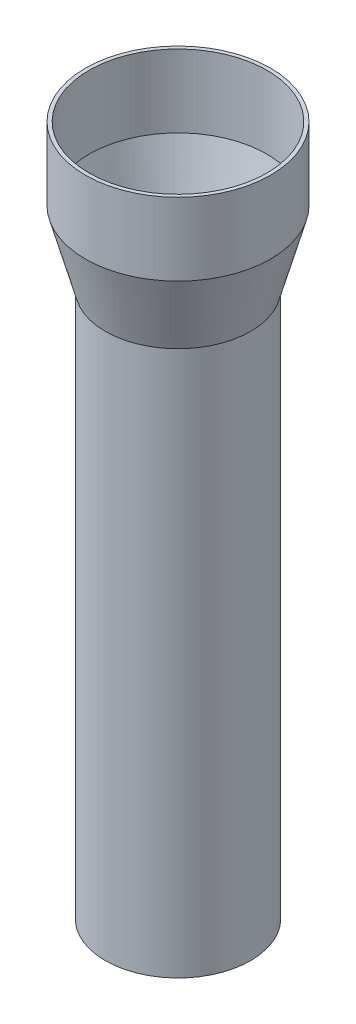
ISO-10303-21;
HEADER;
FILE_DESCRIPTION(('STEP AP214'),'2;1');
FILE_NAME('part.step','',(''),(''),'','','');
FILE_SCHEMA(('AUTOMOTIVE_DESIGN { 1 0 10303 214 1 1 1 1 }'));
ENDSEC;
DATA;
#1=APPLICATION_CONTEXT('core data for automotive mechanical design processes');
#2=APPLICATION_PROTOCOL_DEFINITION('international standard','automotive_design',2000,#1);
#3=PRODUCT_CONTEXT('',#1,'mechanical');
#4=PRODUCT('Part','Part','',(#3));
#5=PRODUCT_RELATED_PRODUCT_CATEGORY('part','',(#4));
#6=PRODUCT_DEFINITION_FORMATION('','',#4);
#7=PRODUCT_DEFINITION_CONTEXT('part definition',#1,'design');
#8=PRODUCT_DEFINITION('design','',#6,#7);
#9=PRODUCT_DEFINITION_SHAPE('','',#8);
#10=(LENGTH_UNIT() NAMED_UNIT(*) SI_UNIT(.MILLI.,.METRE.));
#11=(NAMED_UNIT(*) PLANE_ANGLE_UNIT() SI_UNIT($,.RADIAN.));
#12=(NAMED_UNIT(*) SI_UNIT($,.STERADIAN.) SOLID_ANGLE_UNIT());
#13=UNCERTAINTY_MEASURE_WITH_UNIT(LENGTH_MEASURE(1.E-05),#10,'distance_accuracy_value','');
#14=(GEOMETRIC_REPRESENTATION_CONTEXT(3) GLOBAL_UNCERTAINTY_ASSIGNED_CONTEXT((#13)) GLOBAL_UNIT_ASSIGNED_CONTEXT((#10,
#11,#12)) REPRESENTATION_CONTEXT('',''));
#15=CARTESIAN_POINT('',(0.,0.,0.));
#16=DIRECTION('',(0.,0.,1.));
#17=DIRECTION('',(1.,0.,0.));
#18=AXIS2_PLACEMENT_3D('',#15,#16,#17);
#19=CARTESIAN_POINT('',(0.,75.,0.));
#20=DIRECTION('',(0.,-1.,0.));
#21=DIRECTION('',(0.,0.,-1.));
#22=AXIS2_PLACEMENT_3D('',#19,#20,#21);
#23=CYLINDRICAL_SURFACE('',#22,10.);
#24=CARTESIAN_POINT('',(0.,75.,0.));
#25=DIRECTION('',(0.,1.,0.));
#26=DIRECTION('',(0.,0.,1.));
#27=AXIS2_PLACEMENT_3D('',#24,#25,#26);
#28=CIRCLE('',#27,10.);
#29=CARTESIAN_POINT('',(0.,75.,10.));
#30=VERTEX_POINT('',#29);
#31=EDGE_CURVE('E10',#30,#30,#28,.T.);
#32=ORIENTED_EDGE('',*,*,#31,.F.);
#33=EDGE_LOOP('',(#32));
#34=FACE_BOUND('',#33,.T.);
#35=CARTESIAN_POINT('',(0.,0.,0.));
#36=DIRECTION('',(0.,1.,0.));
#37=DIRECTION('',(0.,0.,1.));
#38=AXIS2_PLACEMENT_3D('',#35,#36,#37);
#39=CIRCLE('',#38,10.);
#40=CARTESIAN_POINT('',(0.,0.,10.));
#41=VERTEX_POINT('',#40);
#42=EDGE_CURVE('E40',#41,#41,#39,.T.);
#43=ORIENTED_EDGE('',*,*,#42,.T.);
#44=EDGE_LOOP('',(#43));
#45=FACE_BOUND('',#44,.T.);
#46=ADVANCED_FACE('F37',(#34,#45),#23,.T.);
#47=CARTESIAN_POINT('',(0.,0.,0.));
#48=DIRECTION('',(0.,1.,0.));
#49=DIRECTION('',(0.,0.,1.));
#50=AXIS2_PLACEMENT_3D('',#47,#48,#49);
#51=PLANE('',#50);
#52=CARTESIAN_POINT('',(0.,0.,0.));
#53=DIRECTION('',(0.,1.,0.));
#54=DIRECTION('',(0.,0.,1.));
#55=AXIS2_PLACEMENT_3D('',#52,#53,#54);
#56=CIRCLE('',#55,9.5);
#57=CARTESIAN_POINT('',(0.,0.,9.5));
#58=VERTEX_POINT('',#57);
#59=EDGE_CURVE('E47',#58,#58,#56,.T.);
#60=ORIENTED_EDGE('',*,*,#59,.T.);
#61=EDGE_LOOP('',(#60));
#62=FACE_BOUND('',#61,.T.);
#63=ORIENTED_EDGE('',*,*,#42,.F.);
#64=EDGE_LOOP('',(#63));
#65=FACE_BOUND('',#64,.T.);
#66=ADVANCED_FACE('F87',(#62,#65),#51,.F.);
#67=CARTESIAN_POINT('',(0.,0.,0.));
#68=DIRECTION('',(0.,1.,0.));
#69=DIRECTION('',(0.,0.,1.));
#70=AXIS2_PLACEMENT_3D('',#67,#68,#69);
#71=CYLINDRICAL_SURFACE('',#70,9.5);
#72=ORIENTED_EDGE('',*,*,#59,.F.);
#73=EDGE_LOOP('',(#72));
#74=FACE_BOUND('',#73,.T.);
#75=CARTESIAN_POINT('',(0.,75.,0.));
#76=DIRECTION('',(0.,1.,0.));
#77=DIRECTION('',(0.,0.,1.));
#78=AXIS2_PLACEMENT_3D('',#75,#76,#77);
#79=CIRCLE('',#78,9.5);
#80=CARTESIAN_POINT('',(0.,75.,9.5));
#81=VERTEX_POINT('',#80);
#82=EDGE_CURVE('E54',#81,#81,#79,.T.);
#83=ORIENTED_EDGE('',*,*,#82,.T.);
#84=EDGE_LOOP('',(#83));
#85=FACE_BOUND('',#84,.T.);
#86=ADVANCED_FACE('F78',(#74,#85),#71,.F.);
#87=CARTESIAN_POINT('',(0.,75.,0.));
#88=DIRECTION('',(0.,1.,0.));
#89=DIRECTION('',(0.,0.,1.));
#90=AXIS2_PLACEMENT_3D('',#87,#88,#89);
#91=CONICAL_SURFACE('',#90,10.,0.268366210905907);
#92=CARTESIAN_POINT('',(0.,85.,0.));
#93=DIRECTION('',(0.,1.,0.));
#94=DIRECTION('',(0.,0.,1.));
#95=AXIS2_PLACEMENT_3D('',#92,#93,#94);
#96=CIRCLE('',#95,12.75);
#97=CARTESIAN_POINT('',(0.,85.,12.75));
#98=VERTEX_POINT('',#97);
#99=EDGE_CURVE('E51',#98,#98,#96,.T.);
#100=ORIENTED_EDGE('',*,*,#99,.F.);
#101=EDGE_LOOP('',(#100));
#102=FACE_BOUND('',#101,.T.);
#103=ORIENTED_EDGE('',*,*,#31,.T.);
#104=EDGE_LOOP('',(#103));
#105=FACE_BOUND('',#104,.T.);
#106=ADVANCED_FACE('F75',(#102,#105),#91,.T.);
#107=CARTESIAN_POINT('',(0.,85.,0.));
#108=DIRECTION('',(0.,1.,0.));
#109=DIRECTION('',(0.,0.,1.));
#110=AXIS2_PLACEMENT_3D('',#107,#108,#109);
#111=CONICAL_SURFACE('',#110,12.25,0.268366210905907);
#112=ORIENTED_EDGE('',*,*,#82,.F.);
#113=EDGE_LOOP('',(#112));
#114=FACE_BOUND('',#113,.T.);
#115=CARTESIAN_POINT('',(0.,85.,0.));
#116=DIRECTION('',(0.,1.,0.));
#117=DIRECTION('',(0.,0.,1.));
#118=AXIS2_PLACEMENT_3D('',#115,#116,#117);
#119=CIRCLE('',#118,12.25);
#120=CARTESIAN_POINT('',(0.,85.,12.25));
#121=VERTEX_POINT('',#120);
#122=EDGE_CURVE('E57',#121,#121,#119,.T.);
#123=ORIENTED_EDGE('',*,*,#122,.T.);
#124=EDGE_LOOP('',(#123));
#125=FACE_BOUND('',#124,.T.);
#126=ADVANCED_FACE('F77',(#114,#125),#111,.F.);
#127=CARTESIAN_POINT('',(0.,75.,0.));
#128=DIRECTION('',(0.,1.,0.));
#129=DIRECTION('',(0.,0.,1.));
#130=AXIS2_PLACEMENT_3D('',#127,#128,#129);
#131=CYLINDRICAL_SURFACE('',#130,12.25);
#132=ORIENTED_EDGE('',*,*,#122,.F.);
#133=EDGE_LOOP('',(#132));
#134=FACE_BOUND('',#133,.T.);
#135=CARTESIAN_POINT('',(0.,95.,0.));
#136=DIRECTION('',(0.,1.,0.));
#137=DIRECTION('',(0.,0.,1.));
#138=AXIS2_PLACEMENT_3D('',#135,#136,#137);
#139=CIRCLE('',#138,12.25);
#140=CARTESIAN_POINT('',(0.,95.,12.25));
#141=VERTEX_POINT('',#140);
#142=EDGE_CURVE('E60',#141,#141,#139,.T.);
#143=ORIENTED_EDGE('',*,*,#142,.T.);
#144=EDGE_LOOP('',(#143));
#145=FACE_BOUND('',#144,.T.);
#146=ADVANCED_FACE('F84',(#134,#145),#131,.F.);
#147=CARTESIAN_POINT('',(0.,95.,-12.25));
#148=DIRECTION('',(0.,-1.,0.));
#149=DIRECTION('',(0.,0.,-1.));
#150=AXIS2_PLACEMENT_3D('',#147,#148,#149);
#151=PLANE('',#150);
#152=ORIENTED_EDGE('',*,*,#142,.F.);
#153=EDGE_LOOP('',(#152));
#154=FACE_BOUND('',#153,.T.);
#155=CARTESIAN_POINT('',(0.,95.,0.));
#156=DIRECTION('',(0.,1.,0.));
#157=DIRECTION('',(0.,0.,1.));
#158=AXIS2_PLACEMENT_3D('',#155,#156,#157);
#159=CIRCLE('',#158,12.75);
#160=CARTESIAN_POINT('',(0.,95.,12.75));
#161=VERTEX_POINT('',#160);
#162=EDGE_CURVE('E63',#161,#161,#159,.T.);
#163=ORIENTED_EDGE('',*,*,#162,.T.);
#164=EDGE_LOOP('',(#163));
#165=FACE_BOUND('',#164,.T.);
#166=ADVANCED_FACE('F67',(#154,#165),#151,.F.);
#167=CARTESIAN_POINT('',(0.,75.,0.));
#168=DIRECTION('',(0.,1.,0.));
#169=DIRECTION('',(0.,0.,1.));
#170=AXIS2_PLACEMENT_3D('',#167,#168,#169);
#171=CYLINDRICAL_SURFACE('',#170,12.75);
#172=ORIENTED_EDGE('',*,*,#162,.F.);
#173=EDGE_LOOP('',(#172));
#174=FACE_BOUND('',#173,.T.);
#175=ORIENTED_EDGE('',*,*,#99,.T.);
#176=EDGE_LOOP('',(#175));
#177=FACE_BOUND('',#176,.T.);
#178=ADVANCED_FACE('F69',(#174,#177),#171,.T.);
#179=CLOSED_SHELL('',(#46,#66,#86,#106,#126,#146,#166,#178));
#180=MANIFOLD_SOLID_BREP('B2',#179);
#181=ADVANCED_BREP_SHAPE_REPRESENTATION('',(#18,#180),#14);
#182=SHAPE_DEFINITION_REPRESENTATION(#9,#181);
ENDSEC;
END-ISO-10303-21;
